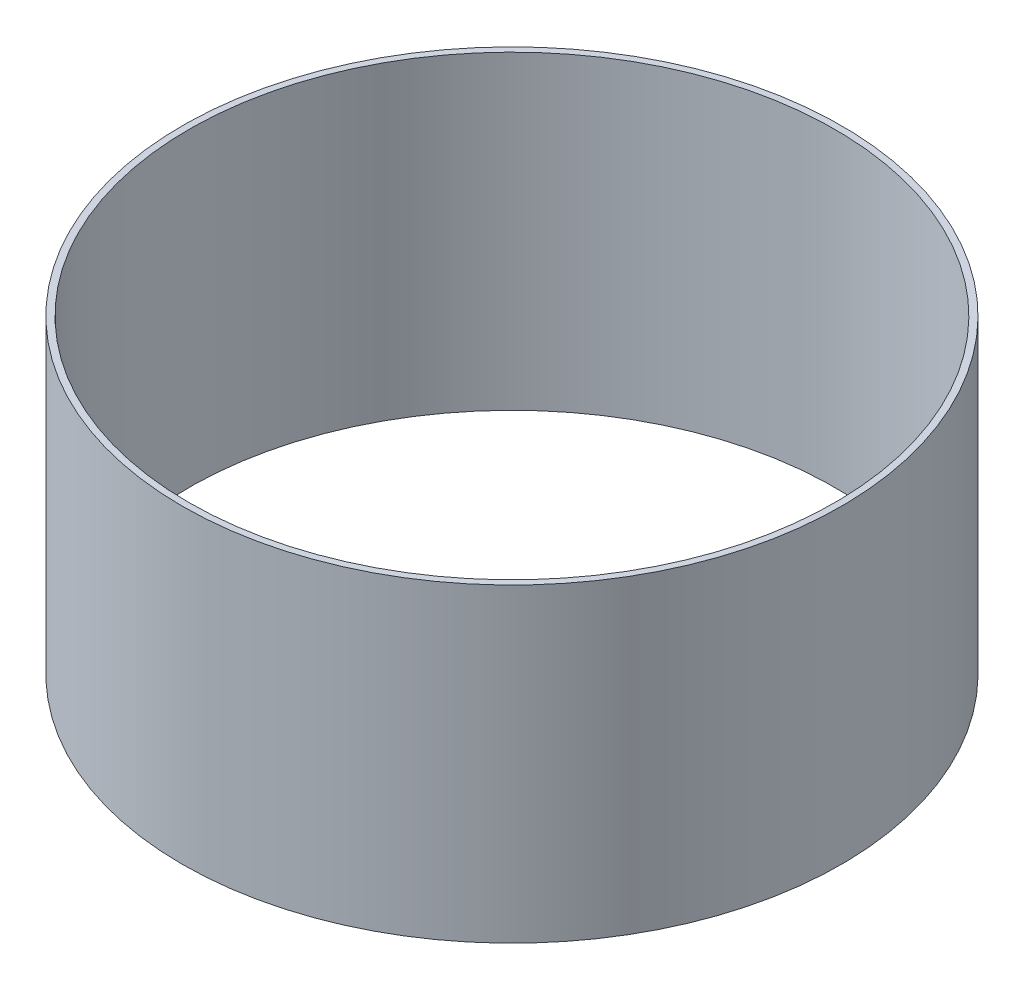
ISO-10303-21;
HEADER;
FILE_DESCRIPTION(('STEP AP214'),'2;1');
FILE_NAME('part.step','',(''),(''),'','','');
FILE_SCHEMA(('AUTOMOTIVE_DESIGN { 1 0 10303 214 1 1 1 1 }'));
ENDSEC;
DATA;
#1=APPLICATION_CONTEXT('core data for automotive mechanical design processes');
#2=APPLICATION_PROTOCOL_DEFINITION('international standard','automotive_design',2000,#1);
#3=PRODUCT_CONTEXT('',#1,'mechanical');
#4=PRODUCT('Part','Part','',(#3));
#5=PRODUCT_RELATED_PRODUCT_CATEGORY('part','',(#4));
#6=PRODUCT_DEFINITION_FORMATION('','',#4);
#7=PRODUCT_DEFINITION_CONTEXT('part definition',#1,'design');
#8=PRODUCT_DEFINITION('design','',#6,#7);
#9=PRODUCT_DEFINITION_SHAPE('','',#8);
#10=(LENGTH_UNIT() NAMED_UNIT(*) SI_UNIT(.MILLI.,.METRE.));
#11=(NAMED_UNIT(*) PLANE_ANGLE_UNIT() SI_UNIT($,.RADIAN.));
#12=(NAMED_UNIT(*) SI_UNIT($,.STERADIAN.) SOLID_ANGLE_UNIT());
#13=UNCERTAINTY_MEASURE_WITH_UNIT(LENGTH_MEASURE(1.E-05),#10,'distance_accuracy_value','');
#14=(GEOMETRIC_REPRESENTATION_CONTEXT(3) GLOBAL_UNCERTAINTY_ASSIGNED_CONTEXT((#13)) GLOBAL_UNIT_ASSIGNED_CONTEXT((#10,
#11,#12)) REPRESENTATION_CONTEXT('',''));
#15=CARTESIAN_POINT('',(0.,0.,0.));
#16=DIRECTION('',(0.,0.,1.));
#17=DIRECTION('',(1.,0.,0.));
#18=AXIS2_PLACEMENT_3D('',#15,#16,#17);
#19=CARTESIAN_POINT('',(0.,-96.0000000000001,0.));
#20=DIRECTION('',(0.,1.,0.));
#21=DIRECTION('',(0.,0.,1.));
#22=AXIS2_PLACEMENT_3D('',#19,#20,#21);
#23=CYLINDRICAL_SURFACE('',#22,102.);
#24=CARTESIAN_POINT('',(0.,-96.0000000000001,0.));
#25=DIRECTION('',(0.,1.,0.));
#26=DIRECTION('',(0.,0.,1.));
#27=AXIS2_PLACEMENT_3D('',#24,#25,#26);
#28=CIRCLE('',#27,102.);
#29=CARTESIAN_POINT('',(0.,-96.0000000000001,102.));
#30=VERTEX_POINT('',#29);
#31=EDGE_CURVE('E10',#30,#30,#28,.T.);
#32=ORIENTED_EDGE('',*,*,#31,.T.);
#33=EDGE_LOOP('',(#32));
#34=FACE_BOUND('',#33,.T.);
#35=CARTESIAN_POINT('',(0.,0.,0.));
#36=DIRECTION('',(0.,1.,0.));
#37=DIRECTION('',(0.,0.,1.));
#38=AXIS2_PLACEMENT_3D('',#35,#36,#37);
#39=CIRCLE('',#38,102.);
#40=CARTESIAN_POINT('',(0.,0.,102.));
#41=VERTEX_POINT('',#40);
#42=EDGE_CURVE('E44',#41,#41,#39,.T.);
#43=ORIENTED_EDGE('',*,*,#42,.F.);
#44=EDGE_LOOP('',(#43));
#45=FACE_BOUND('',#44,.T.);
#46=ADVANCED_FACE('F41',(#34,#45),#23,.T.);
#47=CARTESIAN_POINT('',(0.,-96.0000000000001,0.));
#48=DIRECTION('',(0.,1.,0.));
#49=DIRECTION('',(0.,0.,1.));
#50=AXIS2_PLACEMENT_3D('',#47,#48,#49);
#51=PLANE('',#50);
#52=CARTESIAN_POINT('',(0.,-96.0000000000001,0.));
#53=DIRECTION('',(0.,1.,0.));
#54=DIRECTION('',(0.,0.,1.));
#55=AXIS2_PLACEMENT_3D('',#52,#53,#54);
#56=CIRCLE('',#55,100.);
#57=CARTESIAN_POINT('',(0.,-96.0000000000001,100.));
#58=VERTEX_POINT('',#57);
#59=EDGE_CURVE('E53',#58,#58,#56,.T.);
#60=ORIENTED_EDGE('',*,*,#59,.T.);
#61=EDGE_LOOP('',(#60));
#62=FACE_BOUND('',#61,.T.);
#63=ORIENTED_EDGE('',*,*,#31,.F.);
#64=EDGE_LOOP('',(#63));
#65=FACE_BOUND('',#64,.T.);
#66=ADVANCED_FACE('F63',(#62,#65),#51,.F.);
#67=CARTESIAN_POINT('',(0.,0.,0.));
#68=DIRECTION('',(0.,1.,0.));
#69=DIRECTION('',(0.,0.,1.));
#70=AXIS2_PLACEMENT_3D('',#67,#68,#69);
#71=PLANE('',#70);
#72=CARTESIAN_POINT('',(0.,0.,0.));
#73=DIRECTION('',(0.,1.,0.));
#74=DIRECTION('',(0.,0.,1.));
#75=AXIS2_PLACEMENT_3D('',#72,#73,#74);
#76=CIRCLE('',#75,100.);
#77=CARTESIAN_POINT('',(0.,0.,100.));
#78=VERTEX_POINT('',#77);
#79=EDGE_CURVE('E55',#78,#78,#76,.T.);
#80=ORIENTED_EDGE('',*,*,#79,.F.);
#81=EDGE_LOOP('',(#80));
#82=FACE_BOUND('',#81,.T.);
#83=ORIENTED_EDGE('',*,*,#42,.T.);
#84=EDGE_LOOP('',(#83));
#85=FACE_BOUND('',#84,.T.);
#86=ADVANCED_FACE('F69',(#82,#85),#71,.T.);
#87=CARTESIAN_POINT('',(0.,-96.0000000000001,0.));
#88=DIRECTION('',(0.,1.,0.));
#89=DIRECTION('',(0.,0.,1.));
#90=AXIS2_PLACEMENT_3D('',#87,#88,#89);
#91=CYLINDRICAL_SURFACE('',#90,100.);
#92=ORIENTED_EDGE('',*,*,#59,.F.);
#93=EDGE_LOOP('',(#92));
#94=FACE_BOUND('',#93,.T.);
#95=ORIENTED_EDGE('',*,*,#79,.T.);
#96=EDGE_LOOP('',(#95));
#97=FACE_BOUND('',#96,.T.);
#98=ADVANCED_FACE('F66',(#94,#97),#91,.F.);
#99=CLOSED_SHELL('',(#46,#66,#86,#98));
#100=MANIFOLD_SOLID_BREP('B2',#99);
#101=ADVANCED_BREP_SHAPE_REPRESENTATION('',(#18,#100),#14);
#102=SHAPE_DEFINITION_REPRESENTATION(#9,#101);
ENDSEC;
END-ISO-10303-21;
